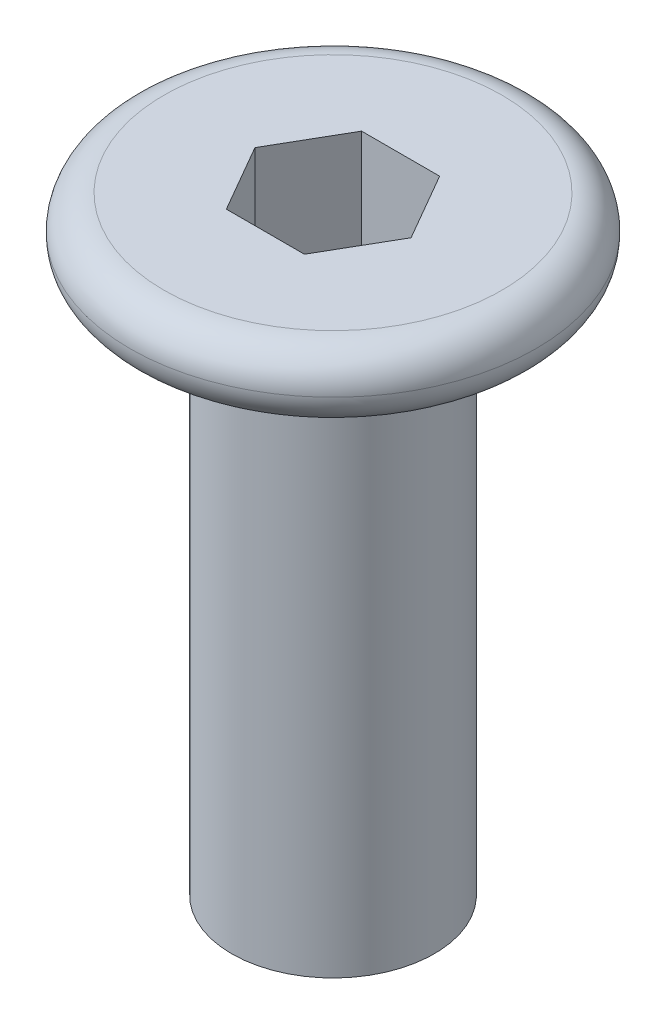
ISO-10303-21;
HEADER;
FILE_DESCRIPTION(('STEP AP214'),'2;1');
FILE_NAME('part.step','',(''),(''),'','','');
FILE_SCHEMA(('AUTOMOTIVE_DESIGN { 1 0 10303 214 1 1 1 1 }'));
ENDSEC;
DATA;
#1=APPLICATION_CONTEXT('core data for automotive mechanical design processes');
#2=APPLICATION_PROTOCOL_DEFINITION('international standard','automotive_design',2000,#1);
#3=PRODUCT_CONTEXT('',#1,'mechanical');
#4=PRODUCT('Part','Part','',(#3));
#5=PRODUCT_RELATED_PRODUCT_CATEGORY('part','',(#4));
#6=PRODUCT_DEFINITION_FORMATION('','',#4);
#7=PRODUCT_DEFINITION_CONTEXT('part definition',#1,'design');
#8=PRODUCT_DEFINITION('design','',#6,#7);
#9=PRODUCT_DEFINITION_SHAPE('','',#8);
#10=(LENGTH_UNIT() NAMED_UNIT(*) SI_UNIT(.MILLI.,.METRE.));
#11=(NAMED_UNIT(*) PLANE_ANGLE_UNIT() SI_UNIT($,.RADIAN.));
#12=(NAMED_UNIT(*) SI_UNIT($,.STERADIAN.) SOLID_ANGLE_UNIT());
#13=UNCERTAINTY_MEASURE_WITH_UNIT(LENGTH_MEASURE(1.E-05),#10,'distance_accuracy_value','');
#14=(GEOMETRIC_REPRESENTATION_CONTEXT(3) GLOBAL_UNCERTAINTY_ASSIGNED_CONTEXT((#13)) GLOBAL_UNIT_ASSIGNED_CONTEXT((#10,
#11,#12)) REPRESENTATION_CONTEXT('',''));
#15=CARTESIAN_POINT('',(0.,0.,0.));
#16=DIRECTION('',(0.,0.,1.));
#17=DIRECTION('',(1.,0.,0.));
#18=AXIS2_PLACEMENT_3D('',#15,#16,#17);
#19=CARTESIAN_POINT('',(0.,1.,0.));
#20=DIRECTION('',(0.,1.,0.));
#21=DIRECTION('',(0.,0.,1.));
#22=AXIS2_PLACEMENT_3D('',#19,#20,#21);
#23=PLANE('',#22);
#24=CARTESIAN_POINT('',(0.,1.,0.));
#25=DIRECTION('',(0.,1.,0.));
#26=DIRECTION('',(0.,0.,1.));
#27=AXIS2_PLACEMENT_3D('',#24,#25,#26);
#28=CIRCLE('',#27,2.5);
#29=CARTESIAN_POINT('',(0.,1.,2.5));
#30=VERTEX_POINT('',#29);
#31=EDGE_CURVE('E11',#30,#30,#28,.T.);
#32=ORIENTED_EDGE('',*,*,#31,.T.);
#33=EDGE_LOOP('',(#32));
#34=FACE_BOUND('',#33,.T.);
#35=DIRECTION('',(1.,0.,0.));
#36=VECTOR('',#35,1.);
#37=CARTESIAN_POINT('',(-0.577350269189626,1.,1.));
#38=LINE('',#37,#36);
#39=CARTESIAN_POINT('',(-0.577350269189626,1.,1.));
#40=VERTEX_POINT('',#39);
#41=CARTESIAN_POINT('',(0.577350269189626,1.,1.));
#42=VERTEX_POINT('',#41);
#43=EDGE_CURVE('E62',#40,#42,#38,.T.);
#44=ORIENTED_EDGE('',*,*,#43,.F.);
#45=DIRECTION('',(0.5,0.,0.866025403784439));
#46=VECTOR('',#45,1.);
#47=CARTESIAN_POINT('',(-1.15470053837925,1.,0.));
#48=LINE('',#47,#46);
#49=CARTESIAN_POINT('',(-1.15470053837925,1.,0.));
#50=VERTEX_POINT('',#49);
#51=EDGE_CURVE('E155',#50,#40,#48,.T.);
#52=ORIENTED_EDGE('',*,*,#51,.F.);
#53=DIRECTION('',(-0.5,0.,0.866025403784439));
#54=VECTOR('',#53,1.);
#55=CARTESIAN_POINT('',(-0.577350269189626,1.,-1.));
#56=LINE('',#55,#54);
#57=CARTESIAN_POINT('',(-0.577350269189626,1.,-1.));
#58=VERTEX_POINT('',#57);
#59=EDGE_CURVE('E152',#58,#50,#56,.T.);
#60=ORIENTED_EDGE('',*,*,#59,.F.);
#61=DIRECTION('',(-1.,0.,0.));
#62=VECTOR('',#61,1.);
#63=CARTESIAN_POINT('',(0.577350269189626,1.,-1.));
#64=LINE('',#63,#62);
#65=CARTESIAN_POINT('',(0.577350269189626,1.,-1.));
#66=VERTEX_POINT('',#65);
#67=EDGE_CURVE('E110',#66,#58,#64,.T.);
#68=ORIENTED_EDGE('',*,*,#67,.F.);
#69=DIRECTION('',(-0.5,0.,-0.866025403784438));
#70=VECTOR('',#69,1.);
#71=CARTESIAN_POINT('',(1.15470053837925,1.,0.));
#72=LINE('',#71,#70);
#73=CARTESIAN_POINT('',(1.15470053837925,1.,0.));
#74=VERTEX_POINT('',#73);
#75=EDGE_CURVE('E146',#74,#66,#72,.T.);
#76=ORIENTED_EDGE('',*,*,#75,.F.);
#77=DIRECTION('',(0.5,0.,-0.866025403784439));
#78=VECTOR('',#77,1.);
#79=CARTESIAN_POINT('',(0.577350269189626,1.,1.));
#80=LINE('',#79,#78);
#81=EDGE_CURVE('E142',#42,#74,#80,.T.);
#82=ORIENTED_EDGE('',*,*,#81,.F.);
#83=EDGE_LOOP('',(#44,#52,#60,#68,#76,#82));
#84=FACE_BOUND('',#83,.T.);
#85=ADVANCED_FACE('F45',(#34,#84),#23,.T.);
#86=CARTESIAN_POINT('',(0.,0.,0.));
#87=DIRECTION('',(0.,1.,0.));
#88=DIRECTION('',(0.,0.,1.));
#89=AXIS2_PLACEMENT_3D('',#86,#87,#88);
#90=PLANE('',#89);
#91=CARTESIAN_POINT('',(0.,0.,0.));
#92=DIRECTION('',(0.,1.,0.));
#93=DIRECTION('',(0.,0.,1.));
#94=AXIS2_PLACEMENT_3D('',#91,#92,#93);
#95=CIRCLE('',#94,2.5);
#96=CARTESIAN_POINT('',(0.,0.,2.5));
#97=VERTEX_POINT('',#96);
#98=EDGE_CURVE('E55',#97,#97,#95,.F.);
#99=ORIENTED_EDGE('',*,*,#98,.T.);
#100=EDGE_LOOP('',(#99));
#101=FACE_BOUND('',#100,.T.);
#102=CARTESIAN_POINT('',(0.,0.,0.));
#103=DIRECTION('',(0.,-1.,0.));
#104=DIRECTION('',(0.,0.,-1.));
#105=AXIS2_PLACEMENT_3D('',#102,#103,#104);
#106=CIRCLE('',#105,1.5);
#107=CARTESIAN_POINT('',(0.,0.,-1.5));
#108=VERTEX_POINT('',#107);
#109=EDGE_CURVE('E174',#108,#108,#106,.T.);
#110=ORIENTED_EDGE('',*,*,#109,.F.);
#111=EDGE_LOOP('',(#110));
#112=FACE_BOUND('',#111,.T.);
#113=ADVANCED_FACE('F182',(#101,#112),#90,.F.);
#114=CARTESIAN_POINT('',(0.,-8.,0.));
#115=DIRECTION('',(0.,1.,0.));
#116=DIRECTION('',(0.,0.,1.));
#117=AXIS2_PLACEMENT_3D('',#114,#115,#116);
#118=CYLINDRICAL_SURFACE('',#117,1.5);
#119=CARTESIAN_POINT('',(0.,-8.,0.));
#120=DIRECTION('',(0.,-1.,0.));
#121=DIRECTION('',(0.,0.,-1.));
#122=AXIS2_PLACEMENT_3D('',#119,#120,#121);
#123=CIRCLE('',#122,1.5);
#124=CARTESIAN_POINT('',(0.,-8.,-1.5));
#125=VERTEX_POINT('',#124);
#126=EDGE_CURVE('E161',#125,#125,#123,.T.);
#127=ORIENTED_EDGE('',*,*,#126,.F.);
#128=EDGE_LOOP('',(#127));
#129=FACE_BOUND('',#128,.T.);
#130=ORIENTED_EDGE('',*,*,#109,.T.);
#131=EDGE_LOOP('',(#130));
#132=FACE_BOUND('',#131,.T.);
#133=ADVANCED_FACE('F222',(#129,#132),#118,.T.);
#134=CARTESIAN_POINT('',(0.,-8.,0.));
#135=DIRECTION('',(0.,-1.,0.));
#136=DIRECTION('',(0.,0.,-1.));
#137=AXIS2_PLACEMENT_3D('',#134,#135,#136);
#138=PLANE('',#137);
#139=ORIENTED_EDGE('',*,*,#126,.T.);
#140=EDGE_LOOP('',(#139));
#141=FACE_BOUND('',#140,.T.);
#142=ADVANCED_FACE('F212',(#141),#138,.T.);
#143=CARTESIAN_POINT('',(-0.577350269189626,-1.,1.));
#144=DIRECTION('',(0.,0.,1.));
#145=DIRECTION('',(1.,0.,0.));
#146=AXIS2_PLACEMENT_3D('',#143,#144,#145);
#147=PLANE('',#146);
#148=ORIENTED_EDGE('',*,*,#43,.T.);
#149=DIRECTION('',(0.,1.,0.));
#150=VECTOR('',#149,1.);
#151=CARTESIAN_POINT('',(0.577350269189626,-1.,1.));
#152=LINE('',#151,#150);
#153=CARTESIAN_POINT('',(0.577350269189626,-1.,1.));
#154=VERTEX_POINT('',#153);
#155=EDGE_CURVE('E92',#154,#42,#152,.T.);
#156=ORIENTED_EDGE('',*,*,#155,.F.);
#157=DIRECTION('',(1.,0.,0.));
#158=VECTOR('',#157,1.);
#159=CARTESIAN_POINT('',(-0.577350269189626,-1.,1.));
#160=LINE('',#159,#158);
#161=CARTESIAN_POINT('',(-0.577350269189626,-1.,1.));
#162=VERTEX_POINT('',#161);
#163=EDGE_CURVE('E158',#162,#154,#160,.T.);
#164=ORIENTED_EDGE('',*,*,#163,.F.);
#165=DIRECTION('',(0.,1.,0.));
#166=VECTOR('',#165,1.);
#167=CARTESIAN_POINT('',(-0.577350269189626,-1.,1.));
#168=LINE('',#167,#166);
#169=EDGE_CURVE('E70',#162,#40,#168,.T.);
#170=ORIENTED_EDGE('',*,*,#169,.T.);
#171=EDGE_LOOP('',(#148,#156,#164,#170));
#172=FACE_BOUND('',#171,.T.);
#173=ADVANCED_FACE('F205',(#172),#147,.F.);
#174=CARTESIAN_POINT('',(-1.15470053837925,-1.,0.));
#175=DIRECTION('',(-0.866025403784439,0.,0.5));
#176=DIRECTION('',(0.5,0.,0.866025403784439));
#177=AXIS2_PLACEMENT_3D('',#174,#175,#176);
#178=PLANE('',#177);
#179=ORIENTED_EDGE('',*,*,#51,.T.);
#180=ORIENTED_EDGE('',*,*,#169,.F.);
#181=DIRECTION('',(0.5,0.,0.866025403784439));
#182=VECTOR('',#181,1.);
#183=CARTESIAN_POINT('',(-1.15470053837925,-1.,0.));
#184=LINE('',#183,#182);
#185=CARTESIAN_POINT('',(-1.15470053837925,-1.,0.));
#186=VERTEX_POINT('',#185);
#187=EDGE_CURVE('E124',#186,#162,#184,.T.);
#188=ORIENTED_EDGE('',*,*,#187,.F.);
#189=DIRECTION('',(0.,1.,0.));
#190=VECTOR('',#189,1.);
#191=CARTESIAN_POINT('',(-1.15470053837925,-1.,0.));
#192=LINE('',#191,#190);
#193=EDGE_CURVE('E115',#186,#50,#192,.T.);
#194=ORIENTED_EDGE('',*,*,#193,.T.);
#195=EDGE_LOOP('',(#179,#180,#188,#194));
#196=FACE_BOUND('',#195,.T.);
#197=ADVANCED_FACE('F203',(#196),#178,.F.);
#198=CARTESIAN_POINT('',(-0.577350269189626,-1.,-1.));
#199=DIRECTION('',(-0.866025403784439,0.,-0.5));
#200=DIRECTION('',(-0.5,0.,0.866025403784439));
#201=AXIS2_PLACEMENT_3D('',#198,#199,#200);
#202=PLANE('',#201);
#203=ORIENTED_EDGE('',*,*,#59,.T.);
#204=ORIENTED_EDGE('',*,*,#193,.F.);
#205=DIRECTION('',(-0.5,0.,0.866025403784439));
#206=VECTOR('',#205,1.);
#207=CARTESIAN_POINT('',(-0.577350269189626,-1.,-1.));
#208=LINE('',#207,#206);
#209=CARTESIAN_POINT('',(-0.577350269189626,-1.,-1.));
#210=VERTEX_POINT('',#209);
#211=EDGE_CURVE('E119',#210,#186,#208,.T.);
#212=ORIENTED_EDGE('',*,*,#211,.F.);
#213=DIRECTION('',(0.,1.,0.));
#214=VECTOR('',#213,1.);
#215=CARTESIAN_POINT('',(-0.577350269189626,-1.,-1.));
#216=LINE('',#215,#214);
#217=EDGE_CURVE('E103',#210,#58,#216,.T.);
#218=ORIENTED_EDGE('',*,*,#217,.T.);
#219=EDGE_LOOP('',(#203,#204,#212,#218));
#220=FACE_BOUND('',#219,.T.);
#221=ADVANCED_FACE('F120',(#220),#202,.F.);
#222=CARTESIAN_POINT('',(0.577350269189626,-1.,-1.));
#223=DIRECTION('',(0.,0.,-1.));
#224=DIRECTION('',(-1.,0.,0.));
#225=AXIS2_PLACEMENT_3D('',#222,#223,#224);
#226=PLANE('',#225);
#227=ORIENTED_EDGE('',*,*,#67,.T.);
#228=ORIENTED_EDGE('',*,*,#217,.F.);
#229=DIRECTION('',(-1.,0.,0.));
#230=VECTOR('',#229,1.);
#231=CARTESIAN_POINT('',(0.577350269189626,-1.,-1.));
#232=LINE('',#231,#230);
#233=CARTESIAN_POINT('',(0.577350269189626,-1.,-1.));
#234=VERTEX_POINT('',#233);
#235=EDGE_CURVE('E107',#234,#210,#232,.T.);
#236=ORIENTED_EDGE('',*,*,#235,.F.);
#237=DIRECTION('',(0.,1.,0.));
#238=VECTOR('',#237,1.);
#239=CARTESIAN_POINT('',(0.577350269189626,-1.,-1.));
#240=LINE('',#239,#238);
#241=EDGE_CURVE('E116',#234,#66,#240,.T.);
#242=ORIENTED_EDGE('',*,*,#241,.T.);
#243=EDGE_LOOP('',(#227,#228,#236,#242));
#244=FACE_BOUND('',#243,.T.);
#245=ADVANCED_FACE('F105',(#244),#226,.F.);
#246=CARTESIAN_POINT('',(1.15470053837925,-1.,0.));
#247=DIRECTION('',(0.866025403784439,0.,-0.5));
#248=DIRECTION('',(-0.5,0.,-0.866025403784438));
#249=AXIS2_PLACEMENT_3D('',#246,#247,#248);
#250=PLANE('',#249);
#251=ORIENTED_EDGE('',*,*,#75,.T.);
#252=ORIENTED_EDGE('',*,*,#241,.F.);
#253=DIRECTION('',(-0.5,0.,-0.866025403784438));
#254=VECTOR('',#253,1.);
#255=CARTESIAN_POINT('',(1.15470053837925,-1.,0.));
#256=LINE('',#255,#254);
#257=CARTESIAN_POINT('',(1.15470053837925,-1.,0.));
#258=VERTEX_POINT('',#257);
#259=EDGE_CURVE('E130',#258,#234,#256,.T.);
#260=ORIENTED_EDGE('',*,*,#259,.F.);
#261=DIRECTION('',(0.,1.,0.));
#262=VECTOR('',#261,1.);
#263=CARTESIAN_POINT('',(1.15470053837925,-1.,0.));
#264=LINE('',#263,#262);
#265=EDGE_CURVE('E166',#258,#74,#264,.T.);
#266=ORIENTED_EDGE('',*,*,#265,.T.);
#267=EDGE_LOOP('',(#251,#252,#260,#266));
#268=FACE_BOUND('',#267,.T.);
#269=ADVANCED_FACE('F200',(#268),#250,.F.);
#270=CARTESIAN_POINT('',(0.577350269189626,-1.,1.));
#271=DIRECTION('',(0.866025403784439,0.,0.5));
#272=DIRECTION('',(0.5,0.,-0.866025403784439));
#273=AXIS2_PLACEMENT_3D('',#270,#271,#272);
#274=PLANE('',#273);
#275=ORIENTED_EDGE('',*,*,#81,.T.);
#276=ORIENTED_EDGE('',*,*,#265,.F.);
#277=DIRECTION('',(0.5,0.,-0.866025403784439));
#278=VECTOR('',#277,1.);
#279=CARTESIAN_POINT('',(0.577350269189626,-1.,1.));
#280=LINE('',#279,#278);
#281=EDGE_CURVE('E134',#154,#258,#280,.T.);
#282=ORIENTED_EDGE('',*,*,#281,.F.);
#283=ORIENTED_EDGE('',*,*,#155,.T.);
#284=EDGE_LOOP('',(#275,#276,#282,#283));
#285=FACE_BOUND('',#284,.T.);
#286=ADVANCED_FACE('F196',(#285),#274,.F.);
#287=CARTESIAN_POINT('',(0.,-1.,0.));
#288=DIRECTION('',(0.,1.,0.));
#289=DIRECTION('',(0.,0.,1.));
#290=AXIS2_PLACEMENT_3D('',#287,#288,#289);
#291=PLANE('',#290);
#292=ORIENTED_EDGE('',*,*,#163,.T.);
#293=ORIENTED_EDGE('',*,*,#281,.T.);
#294=ORIENTED_EDGE('',*,*,#259,.T.);
#295=ORIENTED_EDGE('',*,*,#235,.T.);
#296=ORIENTED_EDGE('',*,*,#211,.T.);
#297=ORIENTED_EDGE('',*,*,#187,.T.);
#298=EDGE_LOOP('',(#292,#293,#294,#295,#296,#297));
#299=FACE_BOUND('',#298,.T.);
#300=ADVANCED_FACE('F127',(#299),#291,.T.);
#301=CARTESIAN_POINT('',(0.,0.5,0.));
#302=DIRECTION('',(0.,1.,0.));
#303=DIRECTION('',(0.,0.,1.));
#304=AXIS2_PLACEMENT_3D('',#301,#302,#303);
#305=TOROIDAL_SURFACE('',#304,2.5,0.5);
#306=ORIENTED_EDGE('',*,*,#31,.F.);
#307=EDGE_LOOP('',(#306));
#308=FACE_BOUND('',#307,.T.);
#309=CARTESIAN_POINT('',(0.,0.5,0.));
#310=DIRECTION('',(0.,1.,0.));
#311=DIRECTION('',(0.,0.,1.));
#312=AXIS2_PLACEMENT_3D('',#309,#310,#311);
#313=CIRCLE('',#312,3.);
#314=CARTESIAN_POINT('',(0.,0.5,3.));
#315=VERTEX_POINT('',#314);
#316=EDGE_CURVE('E49',#315,#315,#313,.F.);
#317=ORIENTED_EDGE('',*,*,#316,.F.);
#318=EDGE_LOOP('',(#317));
#319=FACE_BOUND('',#318,.T.);
#320=ADVANCED_FACE('F47',(#308,#319),#305,.T.);
#321=CARTESIAN_POINT('',(0.,0.5,0.));
#322=DIRECTION('',(0.,1.,0.));
#323=DIRECTION('',(0.,0.,1.));
#324=AXIS2_PLACEMENT_3D('',#321,#322,#323);
#325=TOROIDAL_SURFACE('',#324,2.5,0.5);
#326=ORIENTED_EDGE('',*,*,#98,.F.);
#327=EDGE_LOOP('',(#326));
#328=FACE_BOUND('',#327,.T.);
#329=ORIENTED_EDGE('',*,*,#316,.T.);
#330=EDGE_LOOP('',(#329));
#331=FACE_BOUND('',#330,.T.);
#332=ADVANCED_FACE('F185',(#328,#331),#325,.T.);
#333=CLOSED_SHELL('',(#85,#113,#133,#142,#173,#197,#221,#245,#269,#286,#300,#320,#332));
#334=MANIFOLD_SOLID_BREP('B2',#333);
#335=ADVANCED_BREP_SHAPE_REPRESENTATION('',(#18,#334),#14);
#336=SHAPE_DEFINITION_REPRESENTATION(#9,#335);
ENDSEC;
END-ISO-10303-21;
